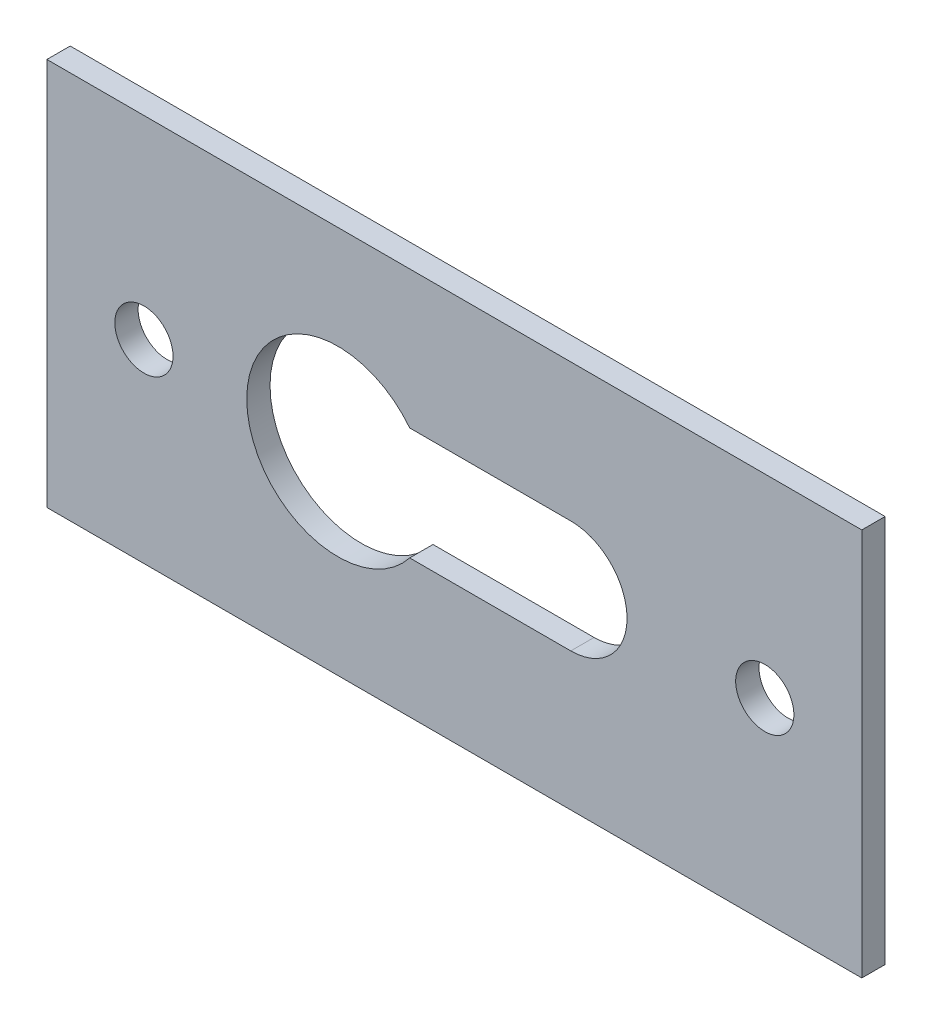
ISO-10303-21;
HEADER;
FILE_DESCRIPTION(('STEP AP214'),'2;1');
FILE_NAME('part.step','',(''),(''),'','','');
FILE_SCHEMA(('AUTOMOTIVE_DESIGN { 1 0 10303 214 1 1 1 1 }'));
ENDSEC;
DATA;
#1=APPLICATION_CONTEXT('core data for automotive mechanical design processes');
#2=APPLICATION_PROTOCOL_DEFINITION('international standard','automotive_design',2000,#1);
#3=PRODUCT_CONTEXT('',#1,'mechanical');
#4=PRODUCT('Part','Part','',(#3));
#5=PRODUCT_RELATED_PRODUCT_CATEGORY('part','',(#4));
#6=PRODUCT_DEFINITION_FORMATION('','',#4);
#7=PRODUCT_DEFINITION_CONTEXT('part definition',#1,'design');
#8=PRODUCT_DEFINITION('design','',#6,#7);
#9=PRODUCT_DEFINITION_SHAPE('','',#8);
#10=(LENGTH_UNIT() NAMED_UNIT(*) SI_UNIT(.MILLI.,.METRE.));
#11=(NAMED_UNIT(*) PLANE_ANGLE_UNIT() SI_UNIT($,.RADIAN.));
#12=(NAMED_UNIT(*) SI_UNIT($,.STERADIAN.) SOLID_ANGLE_UNIT());
#13=UNCERTAINTY_MEASURE_WITH_UNIT(LENGTH_MEASURE(1.E-05),#10,'distance_accuracy_value','');
#14=(GEOMETRIC_REPRESENTATION_CONTEXT(3) GLOBAL_UNCERTAINTY_ASSIGNED_CONTEXT((#13)) GLOBAL_UNIT_ASSIGNED_CONTEXT((#10,
#11,#12)) REPRESENTATION_CONTEXT('',''));
#15=CARTESIAN_POINT('',(0.,0.,0.));
#16=DIRECTION('',(0.,0.,1.));
#17=DIRECTION('',(1.,0.,0.));
#18=AXIS2_PLACEMENT_3D('',#15,#16,#17);
#19=CARTESIAN_POINT('',(0.,0.,1.2));
#20=DIRECTION('',(0.,0.,1.));
#21=DIRECTION('',(1.,0.,0.));
#22=AXIS2_PLACEMENT_3D('',#19,#20,#21);
#23=PLANE('',#22);
#24=DIRECTION('',(-1.,0.,0.));
#25=VECTOR('',#24,1.);
#26=CARTESIAN_POINT('',(27.,2.9,1.2));
#27=LINE('',#26,#25);
#28=CARTESIAN_POINT('',(27.,2.9,1.2));
#29=VERTEX_POINT('',#28);
#30=CARTESIAN_POINT('',(18.6986484017814,2.9,1.2));
#31=VERTEX_POINT('',#30);
#32=EDGE_CURVE('E105',#29,#31,#27,.T.);
#33=ORIENTED_EDGE('',*,*,#32,.F.);
#34=CARTESIAN_POINT('',(27.,0.,1.2));
#35=DIRECTION('',(0.,0.,1.));
#36=DIRECTION('',(1.,0.,0.));
#37=AXIS2_PLACEMENT_3D('',#34,#35,#36);
#38=CIRCLE('',#37,2.9);
#39=CARTESIAN_POINT('',(27.,-2.9,1.2));
#40=VERTEX_POINT('',#39);
#41=EDGE_CURVE('E97',#40,#29,#38,.T.);
#42=ORIENTED_EDGE('',*,*,#41,.F.);
#43=DIRECTION('',(1.,0.,0.));
#44=VECTOR('',#43,1.);
#45=CARTESIAN_POINT('',(27.,-2.9,1.2));
#46=LINE('',#45,#44);
#47=CARTESIAN_POINT('',(18.6986484017814,-2.9,1.2));
#48=VERTEX_POINT('',#47);
#49=EDGE_CURVE('E120',#48,#40,#46,.T.);
#50=ORIENTED_EDGE('',*,*,#49,.F.);
#51=CARTESIAN_POINT('',(15.,0.,1.2));
#52=DIRECTION('',(0.,0.,1.));
#53=DIRECTION('',(1.,0.,0.));
#54=AXIS2_PLACEMENT_3D('',#51,#52,#53);
#55=CIRCLE('',#54,4.7);
#56=EDGE_CURVE('E118',#31,#48,#55,.T.);
#57=ORIENTED_EDGE('',*,*,#56,.F.);
#58=EDGE_LOOP('',(#33,#42,#50,#57));
#59=FACE_BOUND('',#58,.T.);
#60=DIRECTION('',(0.,-1.,0.));
#61=VECTOR('',#60,1.);
#62=CARTESIAN_POINT('',(0.,10.,1.2));
#63=LINE('',#62,#61);
#64=CARTESIAN_POINT('',(0.,10.,1.2));
#65=VERTEX_POINT('',#64);
#66=CARTESIAN_POINT('',(0.,-10.,1.2));
#67=VERTEX_POINT('',#66);
#68=EDGE_CURVE('E142',#65,#67,#63,.T.);
#69=ORIENTED_EDGE('',*,*,#68,.T.);
#70=DIRECTION('',(1.,0.,0.));
#71=VECTOR('',#70,1.);
#72=CARTESIAN_POINT('',(0.,-10.,1.2));
#73=LINE('',#72,#71);
#74=CARTESIAN_POINT('',(42.,-10.,1.2));
#75=VERTEX_POINT('',#74);
#76=EDGE_CURVE('E145',#67,#75,#73,.T.);
#77=ORIENTED_EDGE('',*,*,#76,.T.);
#78=DIRECTION('',(0.,1.,0.));
#79=VECTOR('',#78,1.);
#80=CARTESIAN_POINT('',(42.,10.,1.2));
#81=LINE('',#80,#79);
#82=CARTESIAN_POINT('',(42.,10.,1.2));
#83=VERTEX_POINT('',#82);
#84=EDGE_CURVE('E148',#75,#83,#81,.T.);
#85=ORIENTED_EDGE('',*,*,#84,.T.);
#86=DIRECTION('',(-1.,0.,0.));
#87=VECTOR('',#86,1.);
#88=CARTESIAN_POINT('',(0.,10.,1.2));
#89=LINE('',#88,#87);
#90=EDGE_CURVE('E150',#83,#65,#89,.T.);
#91=ORIENTED_EDGE('',*,*,#90,.T.);
#92=EDGE_LOOP('',(#69,#77,#85,#91));
#93=FACE_BOUND('',#92,.T.);
#94=CARTESIAN_POINT('',(37.,0.,1.2));
#95=DIRECTION('',(0.,0.,1.));
#96=DIRECTION('',(1.,0.,0.));
#97=AXIS2_PLACEMENT_3D('',#94,#95,#96);
#98=CIRCLE('',#97,1.5);
#99=CARTESIAN_POINT('',(38.5,0.,1.2));
#100=VERTEX_POINT('',#99);
#101=EDGE_CURVE('E136',#100,#100,#98,.T.);
#102=ORIENTED_EDGE('',*,*,#101,.F.);
#103=EDGE_LOOP('',(#102));
#104=FACE_BOUND('',#103,.T.);
#105=CARTESIAN_POINT('',(5.,0.,1.2));
#106=DIRECTION('',(0.,0.,1.));
#107=DIRECTION('',(1.,0.,0.));
#108=AXIS2_PLACEMENT_3D('',#105,#106,#107);
#109=CIRCLE('',#108,1.5);
#110=CARTESIAN_POINT('',(6.5,0.,1.2));
#111=VERTEX_POINT('',#110);
#112=EDGE_CURVE('E126',#111,#111,#109,.T.);
#113=ORIENTED_EDGE('',*,*,#112,.F.);
#114=EDGE_LOOP('',(#113));
#115=FACE_BOUND('',#114,.T.);
#116=ADVANCED_FACE('F32',(#59,#93,#104,#115),#23,.T.);
#117=CARTESIAN_POINT('',(0.,0.,0.));
#118=DIRECTION('',(0.,0.,1.));
#119=DIRECTION('',(1.,0.,0.));
#120=AXIS2_PLACEMENT_3D('',#117,#118,#119);
#121=PLANE('',#120);
#122=CARTESIAN_POINT('',(27.,0.,0.));
#123=DIRECTION('',(0.,0.,1.));
#124=DIRECTION('',(1.,0.,0.));
#125=AXIS2_PLACEMENT_3D('',#122,#123,#124);
#126=CIRCLE('',#125,2.9);
#127=CARTESIAN_POINT('',(27.,-2.9,0.));
#128=VERTEX_POINT('',#127);
#129=CARTESIAN_POINT('',(27.,2.9,0.));
#130=VERTEX_POINT('',#129);
#131=EDGE_CURVE('E55',#128,#130,#126,.T.);
#132=ORIENTED_EDGE('',*,*,#131,.T.);
#133=DIRECTION('',(-1.,0.,0.));
#134=VECTOR('',#133,1.);
#135=CARTESIAN_POINT('',(27.,2.9,0.));
#136=LINE('',#135,#134);
#137=CARTESIAN_POINT('',(18.6986484017814,2.9,0.));
#138=VERTEX_POINT('',#137);
#139=EDGE_CURVE('E112',#130,#138,#136,.T.);
#140=ORIENTED_EDGE('',*,*,#139,.T.);
#141=CARTESIAN_POINT('',(15.,0.,0.));
#142=DIRECTION('',(0.,0.,1.));
#143=DIRECTION('',(1.,0.,0.));
#144=AXIS2_PLACEMENT_3D('',#141,#142,#143);
#145=CIRCLE('',#144,4.7);
#146=CARTESIAN_POINT('',(18.6986484017814,-2.9,0.));
#147=VERTEX_POINT('',#146);
#148=EDGE_CURVE('E128',#138,#147,#145,.T.);
#149=ORIENTED_EDGE('',*,*,#148,.T.);
#150=DIRECTION('',(1.,0.,0.));
#151=VECTOR('',#150,1.);
#152=CARTESIAN_POINT('',(27.,-2.9,0.));
#153=LINE('',#152,#151);
#154=EDGE_CURVE('E106',#147,#128,#153,.T.);
#155=ORIENTED_EDGE('',*,*,#154,.T.);
#156=EDGE_LOOP('',(#132,#140,#149,#155));
#157=FACE_BOUND('',#156,.T.);
#158=DIRECTION('',(0.,-1.,0.));
#159=VECTOR('',#158,1.);
#160=CARTESIAN_POINT('',(0.,10.,0.));
#161=LINE('',#160,#159);
#162=CARTESIAN_POINT('',(0.,10.,0.));
#163=VERTEX_POINT('',#162);
#164=CARTESIAN_POINT('',(0.,-10.,0.));
#165=VERTEX_POINT('',#164);
#166=EDGE_CURVE('E139',#163,#165,#161,.T.);
#167=ORIENTED_EDGE('',*,*,#166,.F.);
#168=DIRECTION('',(-1.,0.,0.));
#169=VECTOR('',#168,1.);
#170=CARTESIAN_POINT('',(0.,10.,0.));
#171=LINE('',#170,#169);
#172=CARTESIAN_POINT('',(42.,10.,0.));
#173=VERTEX_POINT('',#172);
#174=EDGE_CURVE('E146',#173,#163,#171,.T.);
#175=ORIENTED_EDGE('',*,*,#174,.F.);
#176=DIRECTION('',(0.,1.,0.));
#177=VECTOR('',#176,1.);
#178=CARTESIAN_POINT('',(42.,10.,0.));
#179=LINE('',#178,#177);
#180=CARTESIAN_POINT('',(42.,-10.,0.));
#181=VERTEX_POINT('',#180);
#182=EDGE_CURVE('E157',#181,#173,#179,.T.);
#183=ORIENTED_EDGE('',*,*,#182,.F.);
#184=DIRECTION('',(1.,0.,0.));
#185=VECTOR('',#184,1.);
#186=CARTESIAN_POINT('',(0.,-10.,0.));
#187=LINE('',#186,#185);
#188=EDGE_CURVE('E155',#165,#181,#187,.T.);
#189=ORIENTED_EDGE('',*,*,#188,.F.);
#190=EDGE_LOOP('',(#167,#175,#183,#189));
#191=FACE_BOUND('',#190,.T.);
#192=CARTESIAN_POINT('',(37.,0.,0.));
#193=DIRECTION('',(0.,0.,1.));
#194=DIRECTION('',(1.,0.,0.));
#195=AXIS2_PLACEMENT_3D('',#192,#193,#194);
#196=CIRCLE('',#195,1.5);
#197=CARTESIAN_POINT('',(38.5,0.,0.));
#198=VERTEX_POINT('',#197);
#199=EDGE_CURVE('E113',#198,#198,#196,.T.);
#200=ORIENTED_EDGE('',*,*,#199,.T.);
#201=EDGE_LOOP('',(#200));
#202=FACE_BOUND('',#201,.T.);
#203=CARTESIAN_POINT('',(5.,0.,0.));
#204=DIRECTION('',(0.,0.,1.));
#205=DIRECTION('',(1.,0.,0.));
#206=AXIS2_PLACEMENT_3D('',#203,#204,#205);
#207=CIRCLE('',#206,1.5);
#208=CARTESIAN_POINT('',(6.5,0.,0.));
#209=VERTEX_POINT('',#208);
#210=EDGE_CURVE('E217',#209,#209,#207,.T.);
#211=ORIENTED_EDGE('',*,*,#210,.T.);
#212=EDGE_LOOP('',(#211));
#213=FACE_BOUND('',#212,.T.);
#214=ADVANCED_FACE('F175',(#157,#191,#202,#213),#121,.F.);
#215=CARTESIAN_POINT('',(0.,10.,1.2));
#216=DIRECTION('',(1.,0.,0.));
#217=DIRECTION('',(0.,0.,-1.));
#218=AXIS2_PLACEMENT_3D('',#215,#216,#217);
#219=PLANE('',#218);
#220=ORIENTED_EDGE('',*,*,#166,.T.);
#221=DIRECTION('',(0.,0.,-1.));
#222=VECTOR('',#221,1.);
#223=CARTESIAN_POINT('',(0.,-10.,1.2));
#224=LINE('',#223,#222);
#225=EDGE_CURVE('E11',#67,#165,#224,.T.);
#226=ORIENTED_EDGE('',*,*,#225,.F.);
#227=ORIENTED_EDGE('',*,*,#68,.F.);
#228=DIRECTION('',(0.,0.,-1.));
#229=VECTOR('',#228,1.);
#230=CARTESIAN_POINT('',(0.,10.,1.2));
#231=LINE('',#230,#229);
#232=EDGE_CURVE('E152',#65,#163,#231,.T.);
#233=ORIENTED_EDGE('',*,*,#232,.T.);
#234=EDGE_LOOP('',(#220,#226,#227,#233));
#235=FACE_BOUND('',#234,.T.);
#236=ADVANCED_FACE('F34',(#235),#219,.F.);
#237=CARTESIAN_POINT('',(0.,-10.,1.2));
#238=DIRECTION('',(0.,1.,0.));
#239=DIRECTION('',(0.,0.,1.));
#240=AXIS2_PLACEMENT_3D('',#237,#238,#239);
#241=PLANE('',#240);
#242=ORIENTED_EDGE('',*,*,#188,.T.);
#243=DIRECTION('',(0.,0.,-1.));
#244=VECTOR('',#243,1.);
#245=CARTESIAN_POINT('',(42.,-10.,1.2));
#246=LINE('',#245,#244);
#247=EDGE_CURVE('E40',#75,#181,#246,.T.);
#248=ORIENTED_EDGE('',*,*,#247,.F.);
#249=ORIENTED_EDGE('',*,*,#76,.F.);
#250=ORIENTED_EDGE('',*,*,#225,.T.);
#251=EDGE_LOOP('',(#242,#248,#249,#250));
#252=FACE_BOUND('',#251,.T.);
#253=ADVANCED_FACE('F185',(#252),#241,.F.);
#254=CARTESIAN_POINT('',(42.,10.,1.2));
#255=DIRECTION('',(-1.,0.,0.));
#256=DIRECTION('',(0.,0.,1.));
#257=AXIS2_PLACEMENT_3D('',#254,#255,#256);
#258=PLANE('',#257);
#259=ORIENTED_EDGE('',*,*,#182,.T.);
#260=DIRECTION('',(0.,0.,-1.));
#261=VECTOR('',#260,1.);
#262=CARTESIAN_POINT('',(42.,10.,1.2));
#263=LINE('',#262,#261);
#264=EDGE_CURVE('E162',#83,#173,#263,.T.);
#265=ORIENTED_EDGE('',*,*,#264,.F.);
#266=ORIENTED_EDGE('',*,*,#84,.F.);
#267=ORIENTED_EDGE('',*,*,#247,.T.);
#268=EDGE_LOOP('',(#259,#265,#266,#267));
#269=FACE_BOUND('',#268,.T.);
#270=ADVANCED_FACE('F169',(#269),#258,.F.);
#271=CARTESIAN_POINT('',(0.,10.,1.2));
#272=DIRECTION('',(0.,-1.,0.));
#273=DIRECTION('',(0.,0.,-1.));
#274=AXIS2_PLACEMENT_3D('',#271,#272,#273);
#275=PLANE('',#274);
#276=ORIENTED_EDGE('',*,*,#174,.T.);
#277=ORIENTED_EDGE('',*,*,#232,.F.);
#278=ORIENTED_EDGE('',*,*,#90,.F.);
#279=ORIENTED_EDGE('',*,*,#264,.T.);
#280=EDGE_LOOP('',(#276,#277,#278,#279));
#281=FACE_BOUND('',#280,.T.);
#282=ADVANCED_FACE('F179',(#281),#275,.F.);
#283=CARTESIAN_POINT('',(37.,0.,1.2));
#284=DIRECTION('',(0.,0.,-1.));
#285=DIRECTION('',(-1.,0.,0.));
#286=AXIS2_PLACEMENT_3D('',#283,#284,#285);
#287=CYLINDRICAL_SURFACE('',#286,1.5);
#288=ORIENTED_EDGE('',*,*,#101,.T.);
#289=EDGE_LOOP('',(#288));
#290=FACE_BOUND('',#289,.T.);
#291=ORIENTED_EDGE('',*,*,#199,.F.);
#292=EDGE_LOOP('',(#291));
#293=FACE_BOUND('',#292,.T.);
#294=ADVANCED_FACE('F200',(#290,#293),#287,.F.);
#295=CARTESIAN_POINT('',(27.,0.,1.2));
#296=DIRECTION('',(0.,0.,-1.));
#297=DIRECTION('',(-1.,0.,0.));
#298=AXIS2_PLACEMENT_3D('',#295,#296,#297);
#299=CYLINDRICAL_SURFACE('',#298,2.9);
#300=ORIENTED_EDGE('',*,*,#131,.F.);
#301=DIRECTION('',(0.,0.,-1.));
#302=VECTOR('',#301,1.);
#303=CARTESIAN_POINT('',(27.,-2.9,1.2));
#304=LINE('',#303,#302);
#305=EDGE_CURVE('E101',#40,#128,#304,.T.);
#306=ORIENTED_EDGE('',*,*,#305,.F.);
#307=ORIENTED_EDGE('',*,*,#41,.T.);
#308=DIRECTION('',(0.,0.,-1.));
#309=VECTOR('',#308,1.);
#310=CARTESIAN_POINT('',(27.,2.9,1.2));
#311=LINE('',#310,#309);
#312=EDGE_CURVE('E100',#29,#130,#311,.T.);
#313=ORIENTED_EDGE('',*,*,#312,.T.);
#314=EDGE_LOOP('',(#300,#306,#307,#313));
#315=FACE_BOUND('',#314,.T.);
#316=ADVANCED_FACE('F99',(#315),#299,.F.);
#317=CARTESIAN_POINT('',(27.,2.9,1.2));
#318=DIRECTION('',(0.,-1.,0.));
#319=DIRECTION('',(0.,0.,-1.));
#320=AXIS2_PLACEMENT_3D('',#317,#318,#319);
#321=PLANE('',#320);
#322=ORIENTED_EDGE('',*,*,#139,.F.);
#323=ORIENTED_EDGE('',*,*,#312,.F.);
#324=ORIENTED_EDGE('',*,*,#32,.T.);
#325=DIRECTION('',(0.,0.,-1.));
#326=VECTOR('',#325,1.);
#327=CARTESIAN_POINT('',(18.6986484017814,2.9,1.2));
#328=LINE('',#327,#326);
#329=EDGE_CURVE('E114',#31,#138,#328,.T.);
#330=ORIENTED_EDGE('',*,*,#329,.T.);
#331=EDGE_LOOP('',(#322,#323,#324,#330));
#332=FACE_BOUND('',#331,.T.);
#333=ADVANCED_FACE('F109',(#332),#321,.T.);
#334=CARTESIAN_POINT('',(15.,0.,1.2));
#335=DIRECTION('',(0.,0.,-1.));
#336=DIRECTION('',(-1.,0.,0.));
#337=AXIS2_PLACEMENT_3D('',#334,#335,#336);
#338=CYLINDRICAL_SURFACE('',#337,4.7);
#339=ORIENTED_EDGE('',*,*,#148,.F.);
#340=ORIENTED_EDGE('',*,*,#329,.F.);
#341=ORIENTED_EDGE('',*,*,#56,.T.);
#342=DIRECTION('',(0.,0.,-1.));
#343=VECTOR('',#342,1.);
#344=CARTESIAN_POINT('',(18.6986484017814,-2.9,1.2));
#345=LINE('',#344,#343);
#346=EDGE_CURVE('E47',#48,#147,#345,.T.);
#347=ORIENTED_EDGE('',*,*,#346,.T.);
#348=EDGE_LOOP('',(#339,#340,#341,#347));
#349=FACE_BOUND('',#348,.T.);
#350=ADVANCED_FACE('F231',(#349),#338,.F.);
#351=CARTESIAN_POINT('',(27.,-2.9,1.2));
#352=DIRECTION('',(0.,1.,0.));
#353=DIRECTION('',(0.,0.,1.));
#354=AXIS2_PLACEMENT_3D('',#351,#352,#353);
#355=PLANE('',#354);
#356=ORIENTED_EDGE('',*,*,#154,.F.);
#357=ORIENTED_EDGE('',*,*,#346,.F.);
#358=ORIENTED_EDGE('',*,*,#49,.T.);
#359=ORIENTED_EDGE('',*,*,#305,.T.);
#360=EDGE_LOOP('',(#356,#357,#358,#359));
#361=FACE_BOUND('',#360,.T.);
#362=ADVANCED_FACE('F226',(#361),#355,.T.);
#363=CARTESIAN_POINT('',(5.,0.,1.2));
#364=DIRECTION('',(0.,0.,-1.));
#365=DIRECTION('',(-1.,0.,0.));
#366=AXIS2_PLACEMENT_3D('',#363,#364,#365);
#367=CYLINDRICAL_SURFACE('',#366,1.5);
#368=ORIENTED_EDGE('',*,*,#112,.T.);
#369=EDGE_LOOP('',(#368));
#370=FACE_BOUND('',#369,.T.);
#371=ORIENTED_EDGE('',*,*,#210,.F.);
#372=EDGE_LOOP('',(#371));
#373=FACE_BOUND('',#372,.T.);
#374=ADVANCED_FACE('F223',(#370,#373),#367,.F.);
#375=CLOSED_SHELL('',(#116,#214,#236,#253,#270,#282,#294,#316,#333,#350,#362,#374));
#376=MANIFOLD_SOLID_BREP('B2',#375);
#377=ADVANCED_BREP_SHAPE_REPRESENTATION('',(#18,#376),#14);
#378=SHAPE_DEFINITION_REPRESENTATION(#9,#377);
ENDSEC;
END-ISO-10303-21;
